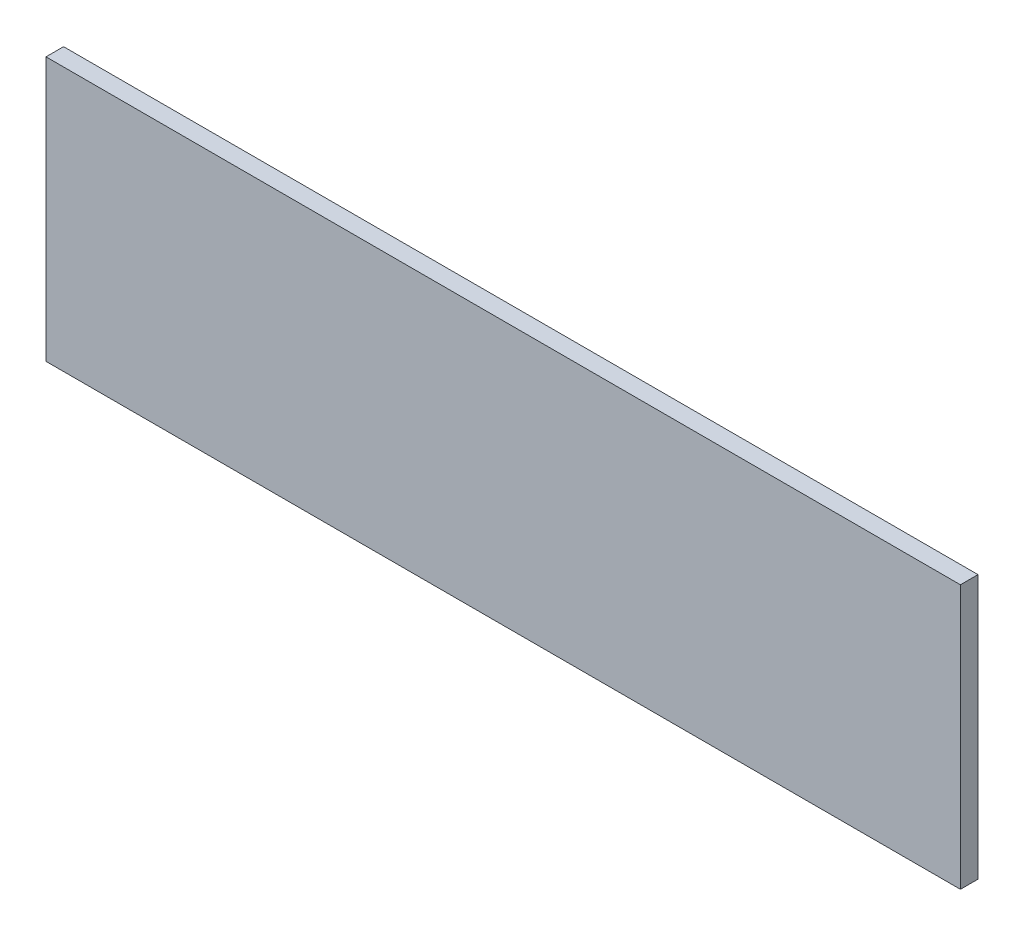
ISO-10303-21;
HEADER;
FILE_DESCRIPTION(('STEP AP214'),'2;1');
FILE_NAME('part.step','',(''),(''),'','','');
FILE_SCHEMA(('AUTOMOTIVE_DESIGN { 1 0 10303 214 1 1 1 1 }'));
ENDSEC;
DATA;
#1=APPLICATION_CONTEXT('core data for automotive mechanical design processes');
#2=APPLICATION_PROTOCOL_DEFINITION('international standard','automotive_design',2000,#1);
#3=PRODUCT_CONTEXT('',#1,'mechanical');
#4=PRODUCT('Part','Part','',(#3));
#5=PRODUCT_RELATED_PRODUCT_CATEGORY('part','',(#4));
#6=PRODUCT_DEFINITION_FORMATION('','',#4);
#7=PRODUCT_DEFINITION_CONTEXT('part definition',#1,'design');
#8=PRODUCT_DEFINITION('design','',#6,#7);
#9=PRODUCT_DEFINITION_SHAPE('','',#8);
#10=(LENGTH_UNIT() NAMED_UNIT(*) SI_UNIT(.MILLI.,.METRE.));
#11=(NAMED_UNIT(*) PLANE_ANGLE_UNIT() SI_UNIT($,.RADIAN.));
#12=(NAMED_UNIT(*) SI_UNIT($,.STERADIAN.) SOLID_ANGLE_UNIT());
#13=UNCERTAINTY_MEASURE_WITH_UNIT(LENGTH_MEASURE(1.E-05),#10,'distance_accuracy_value','');
#14=(GEOMETRIC_REPRESENTATION_CONTEXT(3) GLOBAL_UNCERTAINTY_ASSIGNED_CONTEXT((#13)) GLOBAL_UNIT_ASSIGNED_CONTEXT((#10,
#11,#12)) REPRESENTATION_CONTEXT('',''));
#15=CARTESIAN_POINT('',(0.,0.,0.));
#16=DIRECTION('',(0.,0.,1.));
#17=DIRECTION('',(1.,0.,0.));
#18=AXIS2_PLACEMENT_3D('',#15,#16,#17);
#19=CARTESIAN_POINT('',(0.,0.,1.5875));
#20=DIRECTION('',(1.,0.,0.));
#21=DIRECTION('',(0.,0.,-1.));
#22=AXIS2_PLACEMENT_3D('',#19,#20,#21);
#23=PLANE('',#22);
#24=DIRECTION('',(0.,-1.,0.));
#25=VECTOR('',#24,1.);
#26=CARTESIAN_POINT('',(0.,0.,0.));
#27=LINE('',#26,#25);
#28=CARTESIAN_POINT('',(0.,23.8125,0.));
#29=VERTEX_POINT('',#28);
#30=CARTESIAN_POINT('',(0.,0.,0.));
#31=VERTEX_POINT('',#30);
#32=EDGE_CURVE('E101',#29,#31,#27,.T.);
#33=ORIENTED_EDGE('',*,*,#32,.T.);
#34=DIRECTION('',(0.,0.,-1.));
#35=VECTOR('',#34,1.);
#36=CARTESIAN_POINT('',(0.,0.,1.5875));
#37=LINE('',#36,#35);
#38=CARTESIAN_POINT('',(0.,0.,1.5875));
#39=VERTEX_POINT('',#38);
#40=EDGE_CURVE('E11',#39,#31,#37,.T.);
#41=ORIENTED_EDGE('',*,*,#40,.F.);
#42=DIRECTION('',(0.,-1.,0.));
#43=VECTOR('',#42,1.);
#44=CARTESIAN_POINT('',(0.,0.,1.5875));
#45=LINE('',#44,#43);
#46=CARTESIAN_POINT('',(0.,23.8125,1.5875));
#47=VERTEX_POINT('',#46);
#48=EDGE_CURVE('E89',#47,#39,#45,.T.);
#49=ORIENTED_EDGE('',*,*,#48,.F.);
#50=DIRECTION('',(0.,0.,-1.));
#51=VECTOR('',#50,1.);
#52=CARTESIAN_POINT('',(0.,23.8125,1.5875));
#53=LINE('',#52,#51);
#54=EDGE_CURVE('E97',#47,#29,#53,.T.);
#55=ORIENTED_EDGE('',*,*,#54,.T.);
#56=EDGE_LOOP('',(#33,#41,#49,#55));
#57=FACE_BOUND('',#56,.T.);
#58=ADVANCED_FACE('F38',(#57),#23,.F.);
#59=CARTESIAN_POINT('',(0.,0.,1.5875));
#60=DIRECTION('',(0.,1.,0.));
#61=DIRECTION('',(0.,0.,1.));
#62=AXIS2_PLACEMENT_3D('',#59,#60,#61);
#63=PLANE('',#62);
#64=DIRECTION('',(1.,0.,0.));
#65=VECTOR('',#64,1.);
#66=CARTESIAN_POINT('',(0.,0.,0.));
#67=LINE('',#66,#65);
#68=CARTESIAN_POINT('',(82.55,0.,0.));
#69=VERTEX_POINT('',#68);
#70=EDGE_CURVE('E93',#31,#69,#67,.T.);
#71=ORIENTED_EDGE('',*,*,#70,.T.);
#72=DIRECTION('',(0.,0.,-1.));
#73=VECTOR('',#72,1.);
#74=CARTESIAN_POINT('',(82.55,0.,1.5875));
#75=LINE('',#74,#73);
#76=CARTESIAN_POINT('',(82.55,0.,1.5875));
#77=VERTEX_POINT('',#76);
#78=EDGE_CURVE('E46',#77,#69,#75,.T.);
#79=ORIENTED_EDGE('',*,*,#78,.F.);
#80=DIRECTION('',(1.,0.,0.));
#81=VECTOR('',#80,1.);
#82=CARTESIAN_POINT('',(0.,0.,1.5875));
#83=LINE('',#82,#81);
#84=EDGE_CURVE('E84',#39,#77,#83,.T.);
#85=ORIENTED_EDGE('',*,*,#84,.F.);
#86=ORIENTED_EDGE('',*,*,#40,.T.);
#87=EDGE_LOOP('',(#71,#79,#85,#86));
#88=FACE_BOUND('',#87,.T.);
#89=ADVANCED_FACE('F92',(#88),#63,.F.);
#90=CARTESIAN_POINT('',(82.55,0.,1.5875));
#91=DIRECTION('',(-1.,0.,0.));
#92=DIRECTION('',(0.,0.,1.));
#93=AXIS2_PLACEMENT_3D('',#90,#91,#92);
#94=PLANE('',#93);
#95=DIRECTION('',(0.,1.,0.));
#96=VECTOR('',#95,1.);
#97=CARTESIAN_POINT('',(82.55,0.,0.));
#98=LINE('',#97,#96);
#99=CARTESIAN_POINT('',(82.55,23.8125,0.));
#100=VERTEX_POINT('',#99);
#101=EDGE_CURVE('E71',#69,#100,#98,.T.);
#102=ORIENTED_EDGE('',*,*,#101,.T.);
#103=DIRECTION('',(0.,0.,-1.));
#104=VECTOR('',#103,1.);
#105=CARTESIAN_POINT('',(82.55,23.8125,1.5875));
#106=LINE('',#105,#104);
#107=CARTESIAN_POINT('',(82.55,23.8125,1.5875));
#108=VERTEX_POINT('',#107);
#109=EDGE_CURVE('E94',#108,#100,#106,.T.);
#110=ORIENTED_EDGE('',*,*,#109,.F.);
#111=DIRECTION('',(0.,1.,0.));
#112=VECTOR('',#111,1.);
#113=CARTESIAN_POINT('',(82.55,0.,1.5875));
#114=LINE('',#113,#112);
#115=EDGE_CURVE('E87',#77,#108,#114,.T.);
#116=ORIENTED_EDGE('',*,*,#115,.F.);
#117=ORIENTED_EDGE('',*,*,#78,.T.);
#118=EDGE_LOOP('',(#102,#110,#116,#117));
#119=FACE_BOUND('',#118,.T.);
#120=ADVANCED_FACE('F95',(#119),#94,.F.);
#121=CARTESIAN_POINT('',(0.,23.8125,1.5875));
#122=DIRECTION('',(0.,-1.,0.));
#123=DIRECTION('',(0.,0.,-1.));
#124=AXIS2_PLACEMENT_3D('',#121,#122,#123);
#125=PLANE('',#124);
#126=DIRECTION('',(-1.,0.,0.));
#127=VECTOR('',#126,1.);
#128=CARTESIAN_POINT('',(0.,23.8125,0.));
#129=LINE('',#128,#127);
#130=EDGE_CURVE('E77',#100,#29,#129,.T.);
#131=ORIENTED_EDGE('',*,*,#130,.T.);
#132=ORIENTED_EDGE('',*,*,#54,.F.);
#133=DIRECTION('',(-1.,0.,0.));
#134=VECTOR('',#133,1.);
#135=CARTESIAN_POINT('',(0.,23.8125,1.5875));
#136=LINE('',#135,#134);
#137=EDGE_CURVE('E54',#108,#47,#136,.T.);
#138=ORIENTED_EDGE('',*,*,#137,.F.);
#139=ORIENTED_EDGE('',*,*,#109,.T.);
#140=EDGE_LOOP('',(#131,#132,#138,#139));
#141=FACE_BOUND('',#140,.T.);
#142=ADVANCED_FACE('F108',(#141),#125,.F.);
#143=CARTESIAN_POINT('',(0.,0.,1.5875));
#144=DIRECTION('',(0.,0.,-1.));
#145=DIRECTION('',(-1.,0.,0.));
#146=AXIS2_PLACEMENT_3D('',#143,#144,#145);
#147=PLANE('',#146);
#148=ORIENTED_EDGE('',*,*,#48,.T.);
#149=ORIENTED_EDGE('',*,*,#84,.T.);
#150=ORIENTED_EDGE('',*,*,#115,.T.);
#151=ORIENTED_EDGE('',*,*,#137,.T.);
#152=EDGE_LOOP('',(#148,#149,#150,#151));
#153=FACE_BOUND('',#152,.T.);
#154=ADVANCED_FACE('F85',(#153),#147,.F.);
#155=CARTESIAN_POINT('',(0.,0.,0.));
#156=DIRECTION('',(0.,0.,-1.));
#157=DIRECTION('',(-1.,0.,0.));
#158=AXIS2_PLACEMENT_3D('',#155,#156,#157);
#159=PLANE('',#158);
#160=ORIENTED_EDGE('',*,*,#32,.F.);
#161=ORIENTED_EDGE('',*,*,#130,.F.);
#162=ORIENTED_EDGE('',*,*,#101,.F.);
#163=ORIENTED_EDGE('',*,*,#70,.F.);
#164=EDGE_LOOP('',(#160,#161,#162,#163));
#165=FACE_BOUND('',#164,.T.);
#166=ADVANCED_FACE('F111',(#165),#159,.T.);
#167=CLOSED_SHELL('',(#58,#89,#120,#142,#154,#166));
#168=MANIFOLD_SOLID_BREP('B2',#167);
#169=ADVANCED_BREP_SHAPE_REPRESENTATION('',(#18,#168),#14);
#170=SHAPE_DEFINITION_REPRESENTATION(#9,#169);
ENDSEC;
END-ISO-10303-21;
